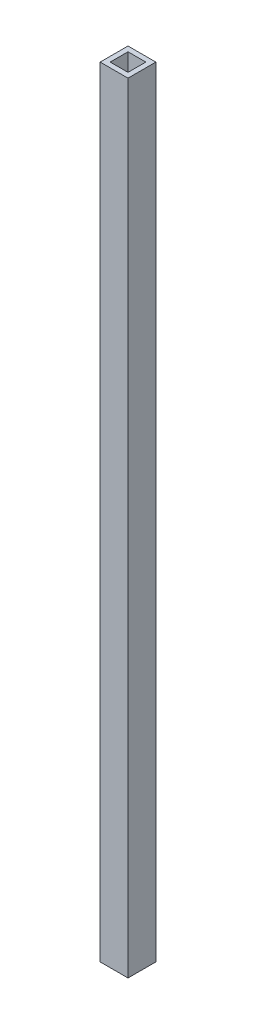
ISO-10303-21;
HEADER;
FILE_DESCRIPTION(('STEP AP214'),'2;1');
FILE_NAME('part.step','',(''),(''),'','','');
FILE_SCHEMA(('AUTOMOTIVE_DESIGN { 1 0 10303 214 1 1 1 1 }'));
ENDSEC;
DATA;
#1=APPLICATION_CONTEXT('core data for automotive mechanical design processes');
#2=APPLICATION_PROTOCOL_DEFINITION('international standard','automotive_design',2000,#1);
#3=PRODUCT_CONTEXT('',#1,'mechanical');
#4=PRODUCT('Part','Part','',(#3));
#5=PRODUCT_RELATED_PRODUCT_CATEGORY('part','',(#4));
#6=PRODUCT_DEFINITION_FORMATION('','',#4);
#7=PRODUCT_DEFINITION_CONTEXT('part definition',#1,'design');
#8=PRODUCT_DEFINITION('design','',#6,#7);
#9=PRODUCT_DEFINITION_SHAPE('','',#8);
#10=(LENGTH_UNIT() NAMED_UNIT(*) SI_UNIT(.MILLI.,.METRE.));
#11=(NAMED_UNIT(*) PLANE_ANGLE_UNIT() SI_UNIT($,.RADIAN.));
#12=(NAMED_UNIT(*) SI_UNIT($,.STERADIAN.) SOLID_ANGLE_UNIT());
#13=UNCERTAINTY_MEASURE_WITH_UNIT(LENGTH_MEASURE(1.E-05),#10,'distance_accuracy_value','');
#14=(GEOMETRIC_REPRESENTATION_CONTEXT(3) GLOBAL_UNCERTAINTY_ASSIGNED_CONTEXT((#13)) GLOBAL_UNIT_ASSIGNED_CONTEXT((#10,
#11,#12)) REPRESENTATION_CONTEXT('',''));
#15=CARTESIAN_POINT('',(0.,0.,0.));
#16=DIRECTION('',(0.,0.,1.));
#17=DIRECTION('',(1.,0.,0.));
#18=AXIS2_PLACEMENT_3D('',#15,#16,#17);
#19=CARTESIAN_POINT('',(0.,280.,0.));
#20=DIRECTION('',(0.,1.,0.));
#21=DIRECTION('',(0.,0.,1.));
#22=AXIS2_PLACEMENT_3D('',#19,#20,#21);
#23=PLANE('',#22);
#24=DIRECTION('',(0.,0.,-1.));
#25=VECTOR('',#24,1.);
#26=CARTESIAN_POINT('',(5.,280.,-5.));
#27=LINE('',#26,#25);
#28=CARTESIAN_POINT('',(5.,280.,5.));
#29=VERTEX_POINT('',#28);
#30=CARTESIAN_POINT('',(5.,280.,-5.));
#31=VERTEX_POINT('',#30);
#32=EDGE_CURVE('E153',#29,#31,#27,.T.);
#33=ORIENTED_EDGE('',*,*,#32,.T.);
#34=DIRECTION('',(-1.,0.,0.));
#35=VECTOR('',#34,1.);
#36=CARTESIAN_POINT('',(-5.,280.,-5.));
#37=LINE('',#36,#35);
#38=CARTESIAN_POINT('',(-5.,280.,-5.));
#39=VERTEX_POINT('',#38);
#40=EDGE_CURVE('E157',#31,#39,#37,.T.);
#41=ORIENTED_EDGE('',*,*,#40,.T.);
#42=DIRECTION('',(0.,0.,1.));
#43=VECTOR('',#42,1.);
#44=CARTESIAN_POINT('',(-5.,280.,-5.));
#45=LINE('',#44,#43);
#46=CARTESIAN_POINT('',(-5.,280.,5.));
#47=VERTEX_POINT('',#46);
#48=EDGE_CURVE('E161',#39,#47,#45,.T.);
#49=ORIENTED_EDGE('',*,*,#48,.T.);
#50=DIRECTION('',(1.,0.,0.));
#51=VECTOR('',#50,1.);
#52=CARTESIAN_POINT('',(-5.,280.,5.));
#53=LINE('',#52,#51);
#54=EDGE_CURVE('E164',#47,#29,#53,.T.);
#55=ORIENTED_EDGE('',*,*,#54,.T.);
#56=EDGE_LOOP('',(#33,#41,#49,#55));
#57=FACE_BOUND('',#56,.T.);
#58=DIRECTION('',(-1.,0.,0.));
#59=VECTOR('',#58,1.);
#60=CARTESIAN_POINT('',(-3.2,280.,-3.2));
#61=LINE('',#60,#59);
#62=CARTESIAN_POINT('',(3.2,280.,-3.2));
#63=VERTEX_POINT('',#62);
#64=CARTESIAN_POINT('',(-3.2,280.,-3.2));
#65=VERTEX_POINT('',#64);
#66=EDGE_CURVE('E114',#63,#65,#61,.T.);
#67=ORIENTED_EDGE('',*,*,#66,.F.);
#68=DIRECTION('',(0.,0.,-1.));
#69=VECTOR('',#68,1.);
#70=CARTESIAN_POINT('',(3.2,280.,-3.2));
#71=LINE('',#70,#69);
#72=CARTESIAN_POINT('',(3.2,280.,3.2));
#73=VERTEX_POINT('',#72);
#74=EDGE_CURVE('E105',#73,#63,#71,.T.);
#75=ORIENTED_EDGE('',*,*,#74,.F.);
#76=DIRECTION('',(1.,0.,0.));
#77=VECTOR('',#76,1.);
#78=CARTESIAN_POINT('',(-3.2,280.,3.2));
#79=LINE('',#78,#77);
#80=CARTESIAN_POINT('',(-3.2,280.,3.2));
#81=VERTEX_POINT('',#80);
#82=EDGE_CURVE('E131',#81,#73,#79,.T.);
#83=ORIENTED_EDGE('',*,*,#82,.F.);
#84=DIRECTION('',(0.,0.,1.));
#85=VECTOR('',#84,1.);
#86=CARTESIAN_POINT('',(-3.2,280.,-3.2));
#87=LINE('',#86,#85);
#88=EDGE_CURVE('E127',#65,#81,#87,.T.);
#89=ORIENTED_EDGE('',*,*,#88,.F.);
#90=EDGE_LOOP('',(#67,#75,#83,#89));
#91=FACE_BOUND('',#90,.T.);
#92=ADVANCED_FACE('F39',(#57,#91),#23,.T.);
#93=CARTESIAN_POINT('',(0.,0.,0.));
#94=DIRECTION('',(0.,1.,0.));
#95=DIRECTION('',(0.,0.,1.));
#96=AXIS2_PLACEMENT_3D('',#93,#94,#95);
#97=PLANE('',#96);
#98=DIRECTION('',(0.,0.,-1.));
#99=VECTOR('',#98,1.);
#100=CARTESIAN_POINT('',(5.,0.,-5.));
#101=LINE('',#100,#99);
#102=CARTESIAN_POINT('',(5.,0.,5.));
#103=VERTEX_POINT('',#102);
#104=CARTESIAN_POINT('',(5.,0.,-5.));
#105=VERTEX_POINT('',#104);
#106=EDGE_CURVE('E123',#103,#105,#101,.T.);
#107=ORIENTED_EDGE('',*,*,#106,.F.);
#108=DIRECTION('',(1.,0.,0.));
#109=VECTOR('',#108,1.);
#110=CARTESIAN_POINT('',(-5.,0.,5.));
#111=LINE('',#110,#109);
#112=CARTESIAN_POINT('',(-5.,0.,5.));
#113=VERTEX_POINT('',#112);
#114=EDGE_CURVE('E158',#113,#103,#111,.T.);
#115=ORIENTED_EDGE('',*,*,#114,.F.);
#116=DIRECTION('',(0.,0.,1.));
#117=VECTOR('',#116,1.);
#118=CARTESIAN_POINT('',(-5.,0.,-5.));
#119=LINE('',#118,#117);
#120=CARTESIAN_POINT('',(-5.,0.,-5.));
#121=VERTEX_POINT('',#120);
#122=EDGE_CURVE('E174',#121,#113,#119,.T.);
#123=ORIENTED_EDGE('',*,*,#122,.F.);
#124=DIRECTION('',(-1.,0.,0.));
#125=VECTOR('',#124,1.);
#126=CARTESIAN_POINT('',(-5.,0.,-5.));
#127=LINE('',#126,#125);
#128=EDGE_CURVE('E171',#105,#121,#127,.T.);
#129=ORIENTED_EDGE('',*,*,#128,.F.);
#130=EDGE_LOOP('',(#107,#115,#123,#129));
#131=FACE_BOUND('',#130,.T.);
#132=DIRECTION('',(0.,0.,-1.));
#133=VECTOR('',#132,1.);
#134=CARTESIAN_POINT('',(3.2,0.,-3.2));
#135=LINE('',#134,#133);
#136=CARTESIAN_POINT('',(3.2,0.,3.2));
#137=VERTEX_POINT('',#136);
#138=CARTESIAN_POINT('',(3.2,0.,-3.2));
#139=VERTEX_POINT('',#138);
#140=EDGE_CURVE('E63',#137,#139,#135,.T.);
#141=ORIENTED_EDGE('',*,*,#140,.T.);
#142=DIRECTION('',(-1.,0.,0.));
#143=VECTOR('',#142,1.);
#144=CARTESIAN_POINT('',(-3.2,0.,-3.2));
#145=LINE('',#144,#143);
#146=CARTESIAN_POINT('',(-3.2,0.,-3.2));
#147=VERTEX_POINT('',#146);
#148=EDGE_CURVE('E121',#139,#147,#145,.T.);
#149=ORIENTED_EDGE('',*,*,#148,.T.);
#150=DIRECTION('',(0.,0.,1.));
#151=VECTOR('',#150,1.);
#152=CARTESIAN_POINT('',(-3.2,0.,-3.2));
#153=LINE('',#152,#151);
#154=CARTESIAN_POINT('',(-3.2,0.,3.2));
#155=VERTEX_POINT('',#154);
#156=EDGE_CURVE('E140',#147,#155,#153,.T.);
#157=ORIENTED_EDGE('',*,*,#156,.T.);
#158=DIRECTION('',(1.,0.,0.));
#159=VECTOR('',#158,1.);
#160=CARTESIAN_POINT('',(-3.2,0.,3.2));
#161=LINE('',#160,#159);
#162=EDGE_CURVE('E115',#155,#137,#161,.T.);
#163=ORIENTED_EDGE('',*,*,#162,.T.);
#164=EDGE_LOOP('',(#141,#149,#157,#163));
#165=FACE_BOUND('',#164,.T.);
#166=ADVANCED_FACE('F197',(#131,#165),#97,.F.);
#167=CARTESIAN_POINT('',(5.,280.,-5.));
#168=DIRECTION('',(-1.,0.,0.));
#169=DIRECTION('',(0.,0.,1.));
#170=AXIS2_PLACEMENT_3D('',#167,#168,#169);
#171=PLANE('',#170);
#172=ORIENTED_EDGE('',*,*,#106,.T.);
#173=DIRECTION('',(0.,-1.,0.));
#174=VECTOR('',#173,1.);
#175=CARTESIAN_POINT('',(5.,280.,-5.));
#176=LINE('',#175,#174);
#177=EDGE_CURVE('E11',#31,#105,#176,.T.);
#178=ORIENTED_EDGE('',*,*,#177,.F.);
#179=ORIENTED_EDGE('',*,*,#32,.F.);
#180=DIRECTION('',(0.,-1.,0.));
#181=VECTOR('',#180,1.);
#182=CARTESIAN_POINT('',(5.,280.,5.));
#183=LINE('',#182,#181);
#184=EDGE_CURVE('E167',#29,#103,#183,.T.);
#185=ORIENTED_EDGE('',*,*,#184,.T.);
#186=EDGE_LOOP('',(#172,#178,#179,#185));
#187=FACE_BOUND('',#186,.T.);
#188=ADVANCED_FACE('F41',(#187),#171,.F.);
#189=CARTESIAN_POINT('',(-5.,280.,-5.));
#190=DIRECTION('',(0.,0.,1.));
#191=DIRECTION('',(1.,0.,0.));
#192=AXIS2_PLACEMENT_3D('',#189,#190,#191);
#193=PLANE('',#192);
#194=ORIENTED_EDGE('',*,*,#128,.T.);
#195=DIRECTION('',(0.,-1.,0.));
#196=VECTOR('',#195,1.);
#197=CARTESIAN_POINT('',(-5.,280.,-5.));
#198=LINE('',#197,#196);
#199=EDGE_CURVE('E48',#39,#121,#198,.T.);
#200=ORIENTED_EDGE('',*,*,#199,.F.);
#201=ORIENTED_EDGE('',*,*,#40,.F.);
#202=ORIENTED_EDGE('',*,*,#177,.T.);
#203=EDGE_LOOP('',(#194,#200,#201,#202));
#204=FACE_BOUND('',#203,.T.);
#205=ADVANCED_FACE('F207',(#204),#193,.F.);
#206=CARTESIAN_POINT('',(-5.,280.,-5.));
#207=DIRECTION('',(1.,0.,0.));
#208=DIRECTION('',(0.,0.,-1.));
#209=AXIS2_PLACEMENT_3D('',#206,#207,#208);
#210=PLANE('',#209);
#211=ORIENTED_EDGE('',*,*,#122,.T.);
#212=DIRECTION('',(0.,-1.,0.));
#213=VECTOR('',#212,1.);
#214=CARTESIAN_POINT('',(-5.,280.,5.));
#215=LINE('',#214,#213);
#216=EDGE_CURVE('E182',#47,#113,#215,.T.);
#217=ORIENTED_EDGE('',*,*,#216,.F.);
#218=ORIENTED_EDGE('',*,*,#48,.F.);
#219=ORIENTED_EDGE('',*,*,#199,.T.);
#220=EDGE_LOOP('',(#211,#217,#218,#219));
#221=FACE_BOUND('',#220,.T.);
#222=ADVANCED_FACE('F191',(#221),#210,.F.);
#223=CARTESIAN_POINT('',(-5.,280.,5.));
#224=DIRECTION('',(0.,0.,-1.));
#225=DIRECTION('',(-1.,0.,0.));
#226=AXIS2_PLACEMENT_3D('',#223,#224,#225);
#227=PLANE('',#226);
#228=ORIENTED_EDGE('',*,*,#114,.T.);
#229=ORIENTED_EDGE('',*,*,#184,.F.);
#230=ORIENTED_EDGE('',*,*,#54,.F.);
#231=ORIENTED_EDGE('',*,*,#216,.T.);
#232=EDGE_LOOP('',(#228,#229,#230,#231));
#233=FACE_BOUND('',#232,.T.);
#234=ADVANCED_FACE('F201',(#233),#227,.F.);
#235=CARTESIAN_POINT('',(3.2,280.,-3.2));
#236=DIRECTION('',(-1.,0.,0.));
#237=DIRECTION('',(0.,0.,1.));
#238=AXIS2_PLACEMENT_3D('',#235,#236,#237);
#239=PLANE('',#238);
#240=ORIENTED_EDGE('',*,*,#140,.F.);
#241=DIRECTION('',(0.,-1.,0.));
#242=VECTOR('',#241,1.);
#243=CARTESIAN_POINT('',(3.2,280.,3.2));
#244=LINE('',#243,#242);
#245=EDGE_CURVE('E109',#73,#137,#244,.T.);
#246=ORIENTED_EDGE('',*,*,#245,.F.);
#247=ORIENTED_EDGE('',*,*,#74,.T.);
#248=DIRECTION('',(0.,-1.,0.));
#249=VECTOR('',#248,1.);
#250=CARTESIAN_POINT('',(3.2,280.,-3.2));
#251=LINE('',#250,#249);
#252=EDGE_CURVE('E108',#63,#139,#251,.T.);
#253=ORIENTED_EDGE('',*,*,#252,.T.);
#254=EDGE_LOOP('',(#240,#246,#247,#253));
#255=FACE_BOUND('',#254,.T.);
#256=ADVANCED_FACE('F107',(#255),#239,.T.);
#257=CARTESIAN_POINT('',(-3.2,280.,-3.2));
#258=DIRECTION('',(0.,0.,1.));
#259=DIRECTION('',(1.,0.,0.));
#260=AXIS2_PLACEMENT_3D('',#257,#258,#259);
#261=PLANE('',#260);
#262=ORIENTED_EDGE('',*,*,#148,.F.);
#263=ORIENTED_EDGE('',*,*,#252,.F.);
#264=ORIENTED_EDGE('',*,*,#66,.T.);
#265=DIRECTION('',(0.,-1.,0.));
#266=VECTOR('',#265,1.);
#267=CARTESIAN_POINT('',(-3.2,280.,-3.2));
#268=LINE('',#267,#266);
#269=EDGE_CURVE('E124',#65,#147,#268,.T.);
#270=ORIENTED_EDGE('',*,*,#269,.T.);
#271=EDGE_LOOP('',(#262,#263,#264,#270));
#272=FACE_BOUND('',#271,.T.);
#273=ADVANCED_FACE('F118',(#272),#261,.T.);
#274=CARTESIAN_POINT('',(-3.2,280.,-3.2));
#275=DIRECTION('',(1.,0.,0.));
#276=DIRECTION('',(0.,0.,-1.));
#277=AXIS2_PLACEMENT_3D('',#274,#275,#276);
#278=PLANE('',#277);
#279=ORIENTED_EDGE('',*,*,#156,.F.);
#280=ORIENTED_EDGE('',*,*,#269,.F.);
#281=ORIENTED_EDGE('',*,*,#88,.T.);
#282=DIRECTION('',(0.,-1.,0.));
#283=VECTOR('',#282,1.);
#284=CARTESIAN_POINT('',(-3.2,280.,3.2));
#285=LINE('',#284,#283);
#286=EDGE_CURVE('E55',#81,#155,#285,.T.);
#287=ORIENTED_EDGE('',*,*,#286,.T.);
#288=EDGE_LOOP('',(#279,#280,#281,#287));
#289=FACE_BOUND('',#288,.T.);
#290=ADVANCED_FACE('F230',(#289),#278,.T.);
#291=CARTESIAN_POINT('',(-3.2,280.,3.2));
#292=DIRECTION('',(0.,0.,-1.));
#293=DIRECTION('',(-1.,0.,0.));
#294=AXIS2_PLACEMENT_3D('',#291,#292,#293);
#295=PLANE('',#294);
#296=ORIENTED_EDGE('',*,*,#162,.F.);
#297=ORIENTED_EDGE('',*,*,#286,.F.);
#298=ORIENTED_EDGE('',*,*,#82,.T.);
#299=ORIENTED_EDGE('',*,*,#245,.T.);
#300=EDGE_LOOP('',(#296,#297,#298,#299));
#301=FACE_BOUND('',#300,.T.);
#302=ADVANCED_FACE('F234',(#301),#295,.T.);
#303=CLOSED_SHELL('',(#92,#166,#188,#205,#222,#234,#256,#273,#290,#302));
#304=MANIFOLD_SOLID_BREP('B2',#303);
#305=ADVANCED_BREP_SHAPE_REPRESENTATION('',(#18,#304),#14);
#306=SHAPE_DEFINITION_REPRESENTATION(#9,#305);
ENDSEC;
END-ISO-10303-21;
